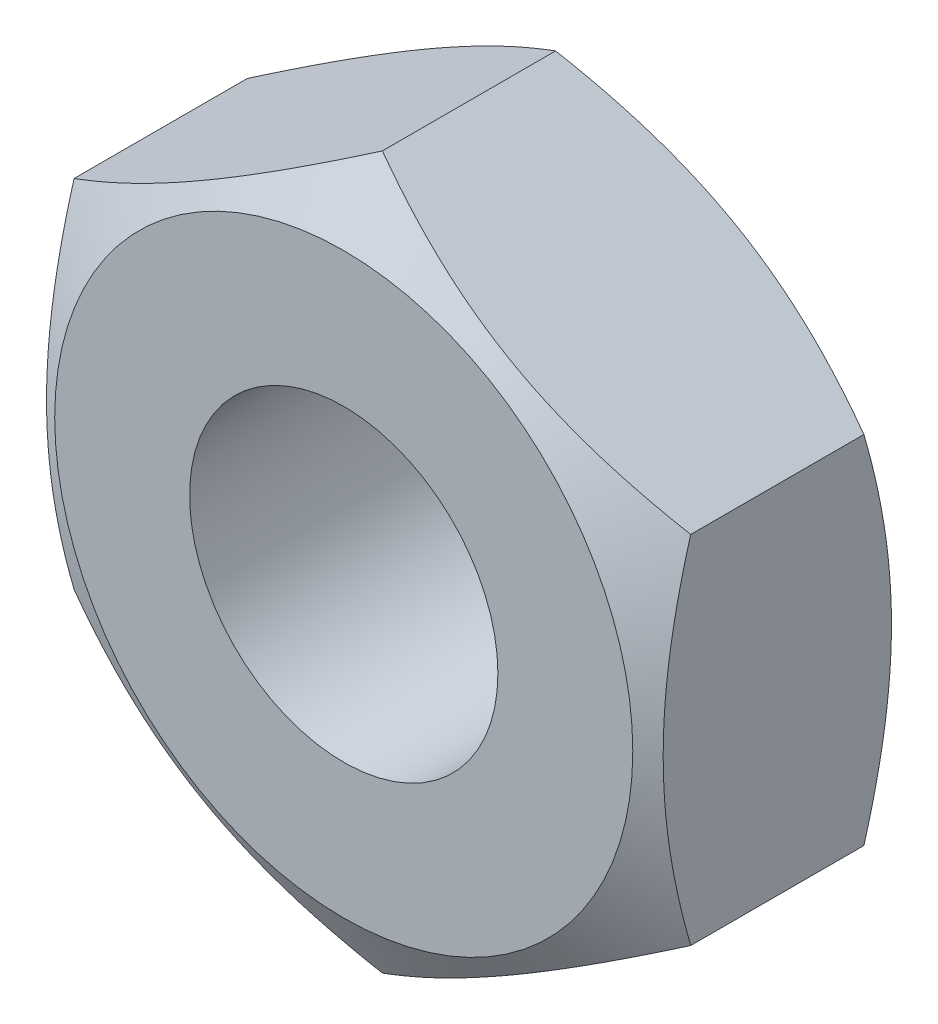
ISO-10303-21;
HEADER;
FILE_DESCRIPTION(('STEP AP214'),'2;1');
FILE_NAME('part.step','',(''),(''),'','','');
FILE_SCHEMA(('AUTOMOTIVE_DESIGN { 1 0 10303 214 1 1 1 1 }'));
ENDSEC;
DATA;
#1=APPLICATION_CONTEXT('core data for automotive mechanical design processes');
#2=APPLICATION_PROTOCOL_DEFINITION('international standard','automotive_design',2000,#1);
#3=PRODUCT_CONTEXT('',#1,'mechanical');
#4=PRODUCT('Part','Part','',(#3));
#5=PRODUCT_RELATED_PRODUCT_CATEGORY('part','',(#4));
#6=PRODUCT_DEFINITION_FORMATION('','',#4);
#7=PRODUCT_DEFINITION_CONTEXT('part definition',#1,'design');
#8=PRODUCT_DEFINITION('design','',#6,#7);
#9=PRODUCT_DEFINITION_SHAPE('','',#8);
#10=(LENGTH_UNIT() NAMED_UNIT(*) SI_UNIT(.MILLI.,.METRE.));
#11=(NAMED_UNIT(*) PLANE_ANGLE_UNIT() SI_UNIT($,.RADIAN.));
#12=(NAMED_UNIT(*) SI_UNIT($,.STERADIAN.) SOLID_ANGLE_UNIT());
#13=UNCERTAINTY_MEASURE_WITH_UNIT(LENGTH_MEASURE(1.E-05),#10,'distance_accuracy_value','');
#14=(GEOMETRIC_REPRESENTATION_CONTEXT(3) GLOBAL_UNCERTAINTY_ASSIGNED_CONTEXT((#13)) GLOBAL_UNIT_ASSIGNED_CONTEXT((#10,
#11,#12)) REPRESENTATION_CONTEXT('',''));
#15=CARTESIAN_POINT('',(0.,0.,0.));
#16=DIRECTION('',(0.,0.,1.));
#17=DIRECTION('',(1.,0.,0.));
#18=AXIS2_PLACEMENT_3D('',#15,#16,#17);
#19=CARTESIAN_POINT('',(0.,0.,1.3));
#20=DIRECTION('',(0.,0.,1.));
#21=DIRECTION('',(1.,0.,0.));
#22=AXIS2_PLACEMENT_3D('',#19,#20,#21);
#23=PLANE('',#22);
#24=CARTESIAN_POINT('',(0.,0.,1.3));
#25=DIRECTION('',(0.,0.,1.));
#26=DIRECTION('',(1.,0.,0.));
#27=AXIS2_PLACEMENT_3D('',#24,#25,#26);
#28=CIRCLE('',#27,0.8);
#29=CARTESIAN_POINT('',(0.8,0.,1.3));
#30=VERTEX_POINT('',#29);
#31=EDGE_CURVE('E114',#30,#30,#28,.T.);
#32=ORIENTED_EDGE('',*,*,#31,.F.);
#33=EDGE_LOOP('',(#32));
#34=FACE_BOUND('',#33,.T.);
#35=CARTESIAN_POINT('',(0.,0.,1.30000000012503));
#36=DIRECTION('',(0.,0.,1.));
#37=DIRECTION('',(1.,0.,0.));
#38=AXIS2_PLACEMENT_3D('',#35,#36,#37);
#39=CIRCLE('',#38,1.5);
#40=CARTESIAN_POINT('',(1.5,0.,1.30000000012503));
#41=VERTEX_POINT('',#40);
#42=EDGE_CURVE('E107',#41,#41,#39,.T.);
#43=ORIENTED_EDGE('',*,*,#42,.T.);
#44=EDGE_LOOP('',(#43));
#45=FACE_BOUND('',#44,.T.);
#46=ADVANCED_FACE('F35',(#34,#45),#23,.T.);
#47=CARTESIAN_POINT('',(0.,0.,0.));
#48=DIRECTION('',(0.,0.,1.));
#49=DIRECTION('',(1.,0.,0.));
#50=AXIS2_PLACEMENT_3D('',#47,#48,#49);
#51=PLANE('',#50);
#52=CARTESIAN_POINT('',(0.,0.,0.));
#53=DIRECTION('',(0.,0.,1.));
#54=DIRECTION('',(1.,0.,0.));
#55=AXIS2_PLACEMENT_3D('',#52,#53,#54);
#56=CIRCLE('',#55,0.8);
#57=CARTESIAN_POINT('',(0.8,0.,0.));
#58=VERTEX_POINT('',#57);
#59=EDGE_CURVE('E193',#58,#58,#56,.T.);
#60=ORIENTED_EDGE('',*,*,#59,.T.);
#61=EDGE_LOOP('',(#60));
#62=FACE_BOUND('',#61,.T.);
#63=CARTESIAN_POINT('',(0.,0.,0.));
#64=DIRECTION('',(0.,0.,1.));
#65=DIRECTION('',(1.,0.,0.));
#66=AXIS2_PLACEMENT_3D('',#63,#64,#65);
#67=CIRCLE('',#66,1.5);
#68=CARTESIAN_POINT('',(1.5,0.,0.));
#69=VERTEX_POINT('',#68);
#70=EDGE_CURVE('E216',#69,#69,#67,.T.);
#71=ORIENTED_EDGE('',*,*,#70,.F.);
#72=EDGE_LOOP('',(#71));
#73=FACE_BOUND('',#72,.T.);
#74=ADVANCED_FACE('F198',(#62,#73),#51,.F.);
#75=CARTESIAN_POINT('',(0.,0.,1.3));
#76=DIRECTION('',(0.,0.,-1.));
#77=DIRECTION('',(-1.,0.,0.));
#78=AXIS2_PLACEMENT_3D('',#75,#76,#77);
#79=CYLINDRICAL_SURFACE('',#78,0.8);
#80=ORIENTED_EDGE('',*,*,#31,.T.);
#81=EDGE_LOOP('',(#80));
#82=FACE_BOUND('',#81,.T.);
#83=ORIENTED_EDGE('',*,*,#59,.F.);
#84=EDGE_LOOP('',(#83));
#85=FACE_BOUND('',#84,.T.);
#86=ADVANCED_FACE('F134',(#82,#85),#79,.F.);
#87=CARTESIAN_POINT('',(0.,0.,0.));
#88=DIRECTION('',(0.,0.,1.));
#89=DIRECTION('',(1.,0.,0.));
#90=AXIS2_PLACEMENT_3D('',#87,#88,#89);
#91=CONICAL_SURFACE('',#90,1.5,1.0471975511966);
#92=ORIENTED_EDGE('',*,*,#70,.T.);
#93=EDGE_LOOP('',(#92));
#94=FACE_BOUND('',#93,.T.);
#95=CARTESIAN_POINT('',(1.6,-2.50468577349947,0.849924364708279));
#96=CARTESIAN_POINT('',(1.6,-2.43460202767632,0.815834229493611));
#97=CARTESIAN_POINT('',(1.6,-2.36435988277678,0.782064282266355));
#98=CARTESIAN_POINT('',(1.6,-2.22347464374357,0.715344391971627));
#99=CARTESIAN_POINT('',(1.6,-2.15283149057303,0.682394573702752));
#100=CARTESIAN_POINT('',(1.6,-2.01070721107587,0.617333772923658));
#101=CARTESIAN_POINT('',(1.6,-1.93922362991863,0.585228134841448));
#102=CARTESIAN_POINT('',(1.6,-1.79569600555535,0.522299939713627));
#103=CARTESIAN_POINT('',(1.6,-1.7236519883453,0.491477323570933));
#104=CARTESIAN_POINT('',(1.6,-1.57647188654226,0.430450934809684));
#105=CARTESIAN_POINT('',(1.6,-1.50131286926166,0.400302173904053));
#106=CARTESIAN_POINT('',(1.6,-1.35013913756586,0.342236448927622));
#107=CARTESIAN_POINT('',(1.6,-1.27412449944285,0.314319287644696));
#108=CARTESIAN_POINT('',(1.6,-1.12123118076986,0.261423138023252));
#109=CARTESIAN_POINT('',(1.6,-1.04435441135613,0.236438680118373));
#110=CARTESIAN_POINT('',(1.6,-0.889498311160903,0.190197331537013));
#111=CARTESIAN_POINT('',(1.6,-0.811519328440935,0.168939291331615));
#112=CARTESIAN_POINT('',(1.6,-0.654849893225062,0.13126960000048));
#113=CARTESIAN_POINT('',(1.6,-0.576166055574703,0.114830940598855));
#114=CARTESIAN_POINT('',(1.6,-0.417796450437888,0.0877122194528207));
#115=CARTESIAN_POINT('',(1.6,-0.338110786381295,0.0770315681597521));
#116=CARTESIAN_POINT('',(1.6,-0.179182918859722,0.0624224858831523));
#117=CARTESIAN_POINT('',(1.6,-0.0999491003970868,0.0584054203386161));
#118=CARTESIAN_POINT('',(1.6,0.0585680255774531,0.0572191037037551));
#119=CARTESIAN_POINT('',(1.6,0.137851333742923,0.060049945045673));
#120=CARTESIAN_POINT('',(1.6,0.326668372227038,0.0747029236686141));
#121=CARTESIAN_POINT('',(1.6,0.435965640909333,0.0895957439673925));
#122=CARTESIAN_POINT('',(1.6,0.652617213639149,0.129849667065771));
#123=CARTESIAN_POINT('',(1.6,0.759969595784866,0.155220591740375));
#124=CARTESIAN_POINT('',(1.6,0.974924274381047,0.214303547661166));
#125=CARTESIAN_POINT('',(1.6,1.08247664582103,0.248192283993812));
#126=CARTESIAN_POINT('',(1.6,1.29558108116508,0.321579269655054));
#127=CARTESIAN_POINT('',(1.6,1.40113363338861,0.361076129039921));
#128=CARTESIAN_POINT('',(1.6,1.5845404985729,0.433654774508611));
#129=CARTESIAN_POINT('',(1.6,1.6627384072109,0.465880326280469));
#130=CARTESIAN_POINT('',(1.6,1.81840642852919,0.532048680957597));
#131=CARTESIAN_POINT('',(1.6,1.89587650673311,0.565991564729156));
#132=CARTESIAN_POINT('',(1.6,2.12743694004725,0.669819808515674));
#133=CARTESIAN_POINT('',(1.6,2.28063578728987,0.741687750031884));
#134=CARTESIAN_POINT('',(1.6,2.58560592559201,0.888815459798253));
#135=CARTESIAN_POINT('',(1.6,2.73737525417081,0.964079246320414));
#136=CARTESIAN_POINT('',(1.6,3.03980063395272,1.11681986452274));
#137=CARTESIAN_POINT('',(1.6,3.19045664179478,1.19429678183293));
#138=CARTESIAN_POINT('',(1.6,3.47701061226264,1.34351109896333));
#139=CARTESIAN_POINT('',(1.6,3.61297937273298,1.41511304145496));
#140=CARTESIAN_POINT('',(1.6,3.88442686694764,1.55925376677231));
#141=CARTESIAN_POINT('',(1.6,4.0199055780314,1.63179259222944));
#142=CARTESIAN_POINT('',(1.6,4.29009317245364,1.77736525360535));
#143=CARTESIAN_POINT('',(1.6,4.42480314919195,1.85039706315399));
#144=CARTESIAN_POINT('',(1.6,4.69391357143419,1.99700833408194));
#145=CARTESIAN_POINT('',(1.6,4.82831403641932,2.07058775968729));
#146=CARTESIAN_POINT('',(1.6,4.96260277023241,2.14436915812481));
#147=B_SPLINE_CURVE_WITH_KNOTS('',3,(#95,#96,#97,#98,#99,#100,#101,#102,#103,#104,#105,#106,
#107,#108,#109,#110,#111,#112,#113,#114,#115,#116,#117,#118,#119,#120,#121,#122,#123,#124,#125,
#126,#127,#128,#129,#130,#131,#132,#133,#134,#135,#136,#137,#138,#139,#140,#141,#142,#143,#144,
#145,#146),.UNSPECIFIED.,.F.,.F.,(4,2,2,2,2,2,2,2,2,2,2,2,2,2,2,2,2,2,2,2,2,2,2,2,2,4),(0.,
0.233807833018182,0.467651029591404,0.702728285106271,0.937794700753746,1.18070863494921,
1.42360107843628,1.66603307095725,1.90839014571078,2.14936186148741,2.3903089000591,
2.62802454191942,2.86574339245545,3.19598511535766,3.52653710253775,3.86461264091271,
4.20260453483314,4.45631563281145,4.71003868875991,5.21761984108872,5.72581822450906,
6.23403629775007,6.69504085670935,7.15606646740554,7.61576479207938,8.07543334526515),.UNSPECIFIED.);
#148=CARTESIAN_POINT('',(1.6,-0.923760430703524,0.200641262882147));
#149=VERTEX_POINT('',#148);
#150=CARTESIAN_POINT('',(1.6,0.923760430703403,0.200641262882228));
#151=VERTEX_POINT('',#150);
#152=EDGE_CURVE('E49',#149,#151,#147,.T.);
#153=ORIENTED_EDGE('',*,*,#152,.F.);
#154=CARTESIAN_POINT('',(-0.000199999999999637,-1.84763633146064,0.200707935798504));
#155=CARTESIAN_POINT('',(0.0701136854573882,-1.8070407062341,0.177258896270012));
#156=CARTESIAN_POINT('',(0.141034310183559,-1.76609466445735,0.155932385774773));
#157=CARTESIAN_POINT('',(0.284103777914678,-1.68349346874997,0.118705682783099));
#158=CARTESIAN_POINT('',(0.356255164197867,-1.64183684645697,0.102818661565885));
#159=CARTESIAN_POINT('',(0.499663699421224,-1.55903989004167,0.0780867414837104));
#160=CARTESIAN_POINT('',(0.570898775556808,-1.51791229965905,0.0690772633205731));
#161=CARTESIAN_POINT('',(0.713704334232898,-1.43546347191564,0.0583192981629597));
#162=CARTESIAN_POINT('',(0.785274297265459,-1.3941425344929,0.0565619053141473));
#163=CARTESIAN_POINT('',(0.919021456137727,-1.31692357631464,0.0602061999775941));
#164=CARTESIAN_POINT('',(0.981218612598265,-1.28101403128932,0.0647130860065737));
#165=CARTESIAN_POINT('',(1.10520768651606,-1.20942890608631,0.0790009031127711));
#166=CARTESIAN_POINT('',(1.166999174705,-1.1737535737468,0.0887867210151748));
#167=CARTESIAN_POINT('',(1.29124415835336,-1.10202069899196,0.113251938248456));
#168=CARTESIAN_POINT('',(1.35368191824457,-1.06597224151117,0.128035106841821));
#169=CARTESIAN_POINT('',(1.47762587183774,-0.994413166539727,0.161587634702251));
#170=CARTESIAN_POINT('',(1.5391336550422,-0.958901631349374,0.180349103662926));
#171=CARTESIAN_POINT('',(1.6002,-0.923644960649564,0.200707935798504));
#172=B_SPLINE_CURVE_WITH_KNOTS('',3,(#154,#155,#156,#157,#158,#159,#160,#161,#162,#163,#164,
#165,#166,#167,#168,#169,#170,#171),.UNSPECIFIED.,.F.,.F.,(4,2,2,2,2,2,2,2,4),(0.,
0.25362862266248,0.507867113505243,0.755812447259193,1.00345320332839,1.21912891721902,
1.43500463041921,1.65567058644228,1.87590291418785),.UNSPECIFIED.);
#173=CARTESIAN_POINT('',(0.,-1.8475208614068,0.200641262882228));
#174=VERTEX_POINT('',#173);
#175=EDGE_CURVE('E92',#174,#149,#172,.T.);
#176=ORIENTED_EDGE('',*,*,#175,.F.);
#177=CARTESIAN_POINT('',(-1.6002,-0.923644960649564,0.200707935798504));
#178=CARTESIAN_POINT('',(-1.52988631454261,-0.964240585876102,0.177258896270012));
#179=CARTESIAN_POINT('',(-1.45896568981644,-1.00518662765285,0.155932385774773));
#180=CARTESIAN_POINT('',(-1.31589622208532,-1.08778782336023,0.118705682783099));
#181=CARTESIAN_POINT('',(-1.24374483580213,-1.12944444565323,0.102818661565886));
#182=CARTESIAN_POINT('',(-1.10033630057878,-1.21224140206853,0.0780867414837107));
#183=CARTESIAN_POINT('',(-1.02910122444319,-1.25336899245115,0.0690772633205732));
#184=CARTESIAN_POINT('',(-0.886295665767102,-1.33581782019457,0.0583192981629597));
#185=CARTESIAN_POINT('',(-0.814725702734541,-1.37713875761731,0.0565619053141474));
#186=CARTESIAN_POINT('',(-0.680978543862273,-1.45435771579556,0.0602061999775942));
#187=CARTESIAN_POINT('',(-0.618781387401734,-1.49026726082088,0.0647130860065738));
#188=CARTESIAN_POINT('',(-0.494792313483936,-1.56185238602389,0.0790009031127712));
#189=CARTESIAN_POINT('',(-0.433000825294996,-1.59752771836341,0.0887867210151749));
#190=CARTESIAN_POINT('',(-0.30875584164664,-1.66926059311824,0.113251938248456));
#191=CARTESIAN_POINT('',(-0.246318081755429,-1.70530905059903,0.128035106841821));
#192=CARTESIAN_POINT('',(-0.122374128162256,-1.77686812557048,0.161587634702252));
#193=CARTESIAN_POINT('',(-0.0608663449577952,-1.81237966076083,0.180349103662926));
#194=CARTESIAN_POINT('',(0.000200000000000447,-1.84763633146064,0.200707935798504));
#195=B_SPLINE_CURVE_WITH_KNOTS('',3,(#177,#178,#179,#180,#181,#182,#183,#184,#185,#186,#187,
#188,#189,#190,#191,#192,#193,#194),.UNSPECIFIED.,.F.,.F.,(4,2,2,2,2,2,2,2,4),(0.,
0.253628622662481,0.507867113505244,0.755812447259193,1.00345320332839,1.21912891721902,
1.43500463041921,1.65567058644228,1.87590291418785),.UNSPECIFIED.);
#196=CARTESIAN_POINT('',(-1.6,-0.923760430703402,0.200641262882228));
#197=VERTEX_POINT('',#196);
#198=EDGE_CURVE('E106',#197,#174,#195,.T.);
#199=ORIENTED_EDGE('',*,*,#198,.F.);
#200=CARTESIAN_POINT('',(-1.6,-2.50468577349947,0.84992436470828));
#201=CARTESIAN_POINT('',(-1.6,-2.43460202767632,0.815834229493612));
#202=CARTESIAN_POINT('',(-1.6,-2.36435988277678,0.782064282266356));
#203=CARTESIAN_POINT('',(-1.6,-2.22347464374357,0.715344391971628));
#204=CARTESIAN_POINT('',(-1.6,-2.15283149057303,0.682394573702753));
#205=CARTESIAN_POINT('',(-1.6,-2.01070721107587,0.617333772923659));
#206=CARTESIAN_POINT('',(-1.6,-1.93922362991863,0.585228134841448));
#207=CARTESIAN_POINT('',(-1.6,-1.79569600555535,0.522299939713628));
#208=CARTESIAN_POINT('',(-1.6,-1.72365198834531,0.491477323570934));
#209=CARTESIAN_POINT('',(-1.6,-1.57647188654226,0.430450934809684));
#210=CARTESIAN_POINT('',(-1.6,-1.50131286926166,0.400302173904053));
#211=CARTESIAN_POINT('',(-1.6,-1.35013913756586,0.342236448927622));
#212=CARTESIAN_POINT('',(-1.6,-1.27412449944285,0.314319287644696));
#213=CARTESIAN_POINT('',(-1.6,-1.12123118076986,0.261423138023253));
#214=CARTESIAN_POINT('',(-1.6,-1.04435441135613,0.236438680118373));
#215=CARTESIAN_POINT('',(-1.6,-0.889498311160903,0.190197331537014));
#216=CARTESIAN_POINT('',(-1.6,-0.811519328440935,0.168939291331615));
#217=CARTESIAN_POINT('',(-1.6,-0.654849893225062,0.131269600000481));
#218=CARTESIAN_POINT('',(-1.6,-0.576166055574703,0.114830940598856));
#219=CARTESIAN_POINT('',(-1.6,-0.417796450437888,0.0877122194528216));
#220=CARTESIAN_POINT('',(-1.6,-0.338110786381295,0.077031568159753));
#221=CARTESIAN_POINT('',(-1.6,-0.179182918859722,0.0624224858831532));
#222=CARTESIAN_POINT('',(-1.6,-0.0999491003970865,0.0584054203386169));
#223=CARTESIAN_POINT('',(-1.6,0.0585680255774536,0.057219103703756));
#224=CARTESIAN_POINT('',(-1.6,0.137851333742924,0.060049945045674));
#225=CARTESIAN_POINT('',(-1.6,0.326668372227039,0.0747029236686151));
#226=CARTESIAN_POINT('',(-1.6,0.435965640909334,0.0895957439673934));
#227=CARTESIAN_POINT('',(-1.6,0.65261721363915,0.129849667065772));
#228=CARTESIAN_POINT('',(-1.6,0.759969595784867,0.155220591740376));
#229=CARTESIAN_POINT('',(-1.6,0.974924274381048,0.214303547661167));
#230=CARTESIAN_POINT('',(-1.6,1.08247664582103,0.248192283993813));
#231=CARTESIAN_POINT('',(-1.6,1.29558108116508,0.321579269655055));
#232=CARTESIAN_POINT('',(-1.6,1.40113363338861,0.361076129039923));
#233=CARTESIAN_POINT('',(-1.6,1.5845404985729,0.433654774508612));
#234=CARTESIAN_POINT('',(-1.6,1.6627384072109,0.46588032628047));
#235=CARTESIAN_POINT('',(-1.6,1.81840642852919,0.532048680957598));
#236=CARTESIAN_POINT('',(-1.6,1.89587650673311,0.565991564729158));
#237=CARTESIAN_POINT('',(-1.6,2.12743694004725,0.669819808515675));
#238=CARTESIAN_POINT('',(-1.6,2.28063578728987,0.741687750031885));
#239=CARTESIAN_POINT('',(-1.6,2.58560592559201,0.888815459798254));
#240=CARTESIAN_POINT('',(-1.6,2.73737525417081,0.964079246320415));
#241=CARTESIAN_POINT('',(-1.6,3.03980063395272,1.11681986452274));
#242=CARTESIAN_POINT('',(-1.6,3.19045664179478,1.19429678183293));
#243=CARTESIAN_POINT('',(-1.6,3.47701061226264,1.34351109896333));
#244=CARTESIAN_POINT('',(-1.6,3.61297937273298,1.41511304145496));
#245=CARTESIAN_POINT('',(-1.6,3.88442686694764,1.55925376677231));
#246=CARTESIAN_POINT('',(-1.6,4.0199055780314,1.63179259222944));
#247=CARTESIAN_POINT('',(-1.6,4.29009317245364,1.77736525360535));
#248=CARTESIAN_POINT('',(-1.6,4.42480314919194,1.85039706315399));
#249=CARTESIAN_POINT('',(-1.6,4.69391357143419,1.99700833408194));
#250=CARTESIAN_POINT('',(-1.6,4.82831403641932,2.07058775968729));
#251=CARTESIAN_POINT('',(-1.6,4.96260277023241,2.14436915812481));
#252=B_SPLINE_CURVE_WITH_KNOTS('',3,(#200,#201,#202,#203,#204,#205,#206,#207,#208,#209,#210,
#211,#212,#213,#214,#215,#216,#217,#218,#219,#220,#221,#222,#223,#224,#225,#226,#227,#228,#229,
#230,#231,#232,#233,#234,#235,#236,#237,#238,#239,#240,#241,#242,#243,#244,#245,#246,#247,#248,
#249,#250,#251),.UNSPECIFIED.,.F.,.F.,(4,2,2,2,2,2,2,2,2,2,2,2,2,2,2,2,2,2,2,2,2,2,2,2,2,4),(0.,
0.233807833018182,0.467651029591404,0.702728285106272,0.937794700753747,1.18070863494921,
1.42360107843628,1.66603307095725,1.90839014571078,2.14936186148741,2.3903089000591,
2.62802454191942,2.86574339245545,3.19598511535766,3.52653710253775,3.86461264091271,
4.20260453483314,4.45631563281145,4.71003868875991,5.21761984108873,5.72581822450906,
6.23403629775007,6.69504085670935,7.15606646740554,7.61576479207938,8.07543334526515),.UNSPECIFIED.);
#253=CARTESIAN_POINT('',(-1.6,0.923760430703401,0.200641262882228));
#254=VERTEX_POINT('',#253);
#255=EDGE_CURVE('E154',#254,#197,#252,.F.);
#256=ORIENTED_EDGE('',*,*,#255,.F.);
#257=CARTESIAN_POINT('',(0.000200000000000008,1.84763633146064,0.200707935798504));
#258=CARTESIAN_POINT('',(-0.0701136854573879,1.8070407062341,0.177258896270012));
#259=CARTESIAN_POINT('',(-0.141034310183559,1.76609466445735,0.155932385774773));
#260=CARTESIAN_POINT('',(-0.284103777914677,1.68349346874997,0.118705682783099));
#261=CARTESIAN_POINT('',(-0.356255164197866,1.64183684645697,0.102818661565885));
#262=CARTESIAN_POINT('',(-0.499663699421223,1.55903989004167,0.0780867414837104));
#263=CARTESIAN_POINT('',(-0.570898775556807,1.51791229965905,0.0690772633205731));
#264=CARTESIAN_POINT('',(-0.713704334232897,1.43546347191564,0.0583192981629596));
#265=CARTESIAN_POINT('',(-0.785274297265459,1.3941425344929,0.0565619053141473));
#266=CARTESIAN_POINT('',(-0.919021456137727,1.31692357631464,0.060206199977594));
#267=CARTESIAN_POINT('',(-0.981218612598265,1.28101403128932,0.0647130860065735));
#268=CARTESIAN_POINT('',(-1.10520768651606,1.20942890608631,0.0790009031127709));
#269=CARTESIAN_POINT('',(-1.166999174705,1.1737535737468,0.0887867210151747));
#270=CARTESIAN_POINT('',(-1.29124415835336,1.10202069899196,0.113251938248456));
#271=CARTESIAN_POINT('',(-1.35368191824457,1.06597224151117,0.128035106841821));
#272=CARTESIAN_POINT('',(-1.47762587183774,0.994413166539726,0.161587634702252));
#273=CARTESIAN_POINT('',(-1.5391336550422,0.958901631349373,0.180349103662926));
#274=CARTESIAN_POINT('',(-1.6002,0.923644960649563,0.200707935798504));
#275=B_SPLINE_CURVE_WITH_KNOTS('',3,(#257,#258,#259,#260,#261,#262,#263,#264,#265,#266,#267,
#268,#269,#270,#271,#272,#273,#274),.UNSPECIFIED.,.F.,.F.,(4,2,2,2,2,2,2,2,4),(0.,
0.25362862266248,0.507867113505243,0.755812447259193,1.00345320332839,1.21912891721902,
1.43500463041921,1.65567058644228,1.87590291418785),.UNSPECIFIED.);
#276=CARTESIAN_POINT('',(0.,1.8475208614068,0.200641262882228));
#277=VERTEX_POINT('',#276);
#278=EDGE_CURVE('E160',#277,#254,#275,.T.);
#279=ORIENTED_EDGE('',*,*,#278,.F.);
#280=CARTESIAN_POINT('',(1.6002,0.923644960649565,0.200707935798504));
#281=CARTESIAN_POINT('',(1.52988631454261,0.964240585876103,0.177258896270012));
#282=CARTESIAN_POINT('',(1.45896568981644,1.00518662765285,0.155932385774773));
#283=CARTESIAN_POINT('',(1.31589622208532,1.08778782336023,0.118705682783099));
#284=CARTESIAN_POINT('',(1.24374483580213,1.12944444565324,0.102818661565885));
#285=CARTESIAN_POINT('',(1.10033630057877,1.21224140206853,0.0780867414837105));
#286=CARTESIAN_POINT('',(1.02910122444319,1.25336899245115,0.0690772633205732));
#287=CARTESIAN_POINT('',(0.886295665767101,1.33581782019457,0.0583192981629599));
#288=CARTESIAN_POINT('',(0.814725702734539,1.37713875761731,0.0565619053141476));
#289=CARTESIAN_POINT('',(0.680978543862271,1.45435771579556,0.0602061999775944));
#290=CARTESIAN_POINT('',(0.618781387401733,1.49026726082088,0.064713086006574));
#291=CARTESIAN_POINT('',(0.494792313483935,1.5618523860239,0.0790009031127715));
#292=CARTESIAN_POINT('',(0.433000825294995,1.59752771836341,0.0887867210151753));
#293=CARTESIAN_POINT('',(0.30875584164664,1.66926059311825,0.113251938248457));
#294=CARTESIAN_POINT('',(0.246318081755429,1.70530905059903,0.128035106841822));
#295=CARTESIAN_POINT('',(0.122374128162256,1.77686812557048,0.161587634702252));
#296=CARTESIAN_POINT('',(0.0608663449577955,1.81237966076083,0.180349103662926));
#297=CARTESIAN_POINT('',(-0.000200000000000167,1.84763633146064,0.200707935798504));
#298=B_SPLINE_CURVE_WITH_KNOTS('',3,(#280,#281,#282,#283,#284,#285,#286,#287,#288,#289,#290,
#291,#292,#293,#294,#295,#296,#297),.UNSPECIFIED.,.F.,.F.,(4,2,2,2,2,2,2,2,4),(0.,
0.25362862266248,0.507867113505243,0.755812447259193,1.00345320332839,1.21912891721902,
1.43500463041921,1.65567058644228,1.87590291418785),.UNSPECIFIED.);
#299=EDGE_CURVE('E63',#151,#277,#298,.T.);
#300=ORIENTED_EDGE('',*,*,#299,.F.);
#301=EDGE_LOOP('',(#153,#176,#199,#256,#279,#300));
#302=FACE_BOUND('',#301,.T.);
#303=ADVANCED_FACE('F91',(#94,#302),#91,.T.);
#304=CARTESIAN_POINT('',(0.,0.,1.30000000012503));
#305=DIRECTION('',(0.,0.,-1.));
#306=DIRECTION('',(-1.,0.,0.));
#307=AXIS2_PLACEMENT_3D('',#304,#305,#306);
#308=CONICAL_SURFACE('',#307,1.5,1.0471975511966);
#309=ORIENTED_EDGE('',*,*,#42,.F.);
#310=EDGE_LOOP('',(#309));
#311=FACE_BOUND('',#310,.T.);
#312=CARTESIAN_POINT('',(1.6002,0.923644960649565,1.09929206432652));
#313=CARTESIAN_POINT('',(1.52988631454261,0.964240585876103,1.12274110385502));
#314=CARTESIAN_POINT('',(1.45896568981644,1.00518662765285,1.14406761435026));
#315=CARTESIAN_POINT('',(1.31589622208532,1.08778782336023,1.18129431734193));
#316=CARTESIAN_POINT('',(1.24374483580213,1.12944444565324,1.19718133855914));
#317=CARTESIAN_POINT('',(1.10033630057877,1.21224140206853,1.22191325864132));
#318=CARTESIAN_POINT('',(1.02910122444319,1.25336899245115,1.23092273680445));
#319=CARTESIAN_POINT('',(0.886295665767101,1.33581782019457,1.24168070196207));
#320=CARTESIAN_POINT('',(0.814725702734539,1.37713875761731,1.24343809481088));
#321=CARTESIAN_POINT('',(0.680978543862271,1.45435771579556,1.23979380014743));
#322=CARTESIAN_POINT('',(0.618781387401733,1.49026726082088,1.23528691411845));
#323=CARTESIAN_POINT('',(0.494792313483935,1.5618523860239,1.22099909701226));
#324=CARTESIAN_POINT('',(0.433000825294995,1.59752771836341,1.21121327910985));
#325=CARTESIAN_POINT('',(0.30875584164664,1.66926059311825,1.18674806187657));
#326=CARTESIAN_POINT('',(0.246318081755429,1.70530905059903,1.17196489328321));
#327=CARTESIAN_POINT('',(0.122374128162257,1.77686812557048,1.13841236542278));
#328=CARTESIAN_POINT('',(0.0608663449577957,1.81237966076083,1.1196508964621));
#329=CARTESIAN_POINT('',(-0.000199999999999724,1.84763633146064,1.09929206432652));
#330=B_SPLINE_CURVE_WITH_KNOTS('',3,(#312,#313,#314,#315,#316,#317,#318,#319,#320,#321,#322,
#323,#324,#325,#326,#327,#328,#329),.UNSPECIFIED.,.F.,.F.,(4,2,2,2,2,2,2,2,4),(0.,
0.25362862266248,0.507867113505243,0.755812447259193,1.00345320332839,1.21912891721902,
1.43500463041921,1.65567058644228,1.87590291418785),.UNSPECIFIED.);
#331=CARTESIAN_POINT('',(1.6,0.923760430703403,1.0993587372428));
#332=VERTEX_POINT('',#331);
#333=CARTESIAN_POINT('',(0.,1.8475208614068,1.0993587372428));
#334=VERTEX_POINT('',#333);
#335=EDGE_CURVE('E183',#332,#334,#330,.T.);
#336=ORIENTED_EDGE('',*,*,#335,.T.);
#337=CARTESIAN_POINT('',(0.000200000000000023,1.84763633146064,1.09929206432652));
#338=CARTESIAN_POINT('',(-0.0701136854573879,1.8070407062341,1.12274110385502));
#339=CARTESIAN_POINT('',(-0.141034310183559,1.76609466445735,1.14406761435025));
#340=CARTESIAN_POINT('',(-0.284103777914677,1.68349346874997,1.18129431734193));
#341=CARTESIAN_POINT('',(-0.356255164197866,1.64183684645697,1.19718133855914));
#342=CARTESIAN_POINT('',(-0.499663699421223,1.55903989004167,1.22191325864132));
#343=CARTESIAN_POINT('',(-0.570898775556807,1.51791229965905,1.23092273680445));
#344=CARTESIAN_POINT('',(-0.713704334232898,1.43546347191564,1.24168070196207));
#345=CARTESIAN_POINT('',(-0.785274297265459,1.3941425344929,1.24343809481088));
#346=CARTESIAN_POINT('',(-0.919021456137727,1.31692357631464,1.23979380014743));
#347=CARTESIAN_POINT('',(-0.981218612598265,1.28101403128932,1.23528691411845));
#348=CARTESIAN_POINT('',(-1.10520768651606,1.20942890608631,1.22099909701226));
#349=CARTESIAN_POINT('',(-1.166999174705,1.1737535737468,1.21121327910985));
#350=CARTESIAN_POINT('',(-1.29124415835336,1.10202069899196,1.18674806187657));
#351=CARTESIAN_POINT('',(-1.35368191824457,1.06597224151117,1.17196489328321));
#352=CARTESIAN_POINT('',(-1.47762587183774,0.994413166539726,1.13841236542278));
#353=CARTESIAN_POINT('',(-1.5391336550422,0.958901631349373,1.1196508964621));
#354=CARTESIAN_POINT('',(-1.6002,0.923644960649563,1.09929206432652));
#355=B_SPLINE_CURVE_WITH_KNOTS('',3,(#337,#338,#339,#340,#341,#342,#343,#344,#345,#346,#347,
#348,#349,#350,#351,#352,#353,#354),.UNSPECIFIED.,.F.,.F.,(4,2,2,2,2,2,2,2,4),(0.,
0.253628622662481,0.507867113505243,0.755812447259193,1.00345320332839,1.21912891721902,
1.43500463041921,1.65567058644228,1.87590291418785),.UNSPECIFIED.);
#356=CARTESIAN_POINT('',(-1.6,0.923760430703401,1.0993587372428));
#357=VERTEX_POINT('',#356);
#358=EDGE_CURVE('E177',#334,#357,#355,.T.);
#359=ORIENTED_EDGE('',*,*,#358,.T.);
#360=CARTESIAN_POINT('',(-1.6,-2.50468577351708,0.45007563540818));
#361=CARTESIAN_POINT('',(-1.6,-2.43460202769379,0.484165770622988));
#362=CARTESIAN_POINT('',(-1.6,-2.3643598827941,0.517935717850388));
#363=CARTESIAN_POINT('',(-1.6,-2.22347464376061,0.584655608145413));
#364=CARTESIAN_POINT('',(-1.6,-2.15283149058993,0.617605426414441));
#365=CARTESIAN_POINT('',(-1.6,-2.0107072110925,0.682666227193851));
#366=CARTESIAN_POINT('',(-1.6,-1.93922362993514,0.714771865276225));
#367=CARTESIAN_POINT('',(-1.6,-1.79569600557161,0.777700060404388));
#368=CARTESIAN_POINT('',(-1.6,-1.72365198836144,0.808522676547262));
#369=CARTESIAN_POINT('',(-1.6,-1.57647188655807,0.869549065308932));
#370=CARTESIAN_POINT('',(-1.6,-1.50131286927727,0.899697826214804));
#371=CARTESIAN_POINT('',(-1.6,-1.35013913758106,0.957763551191739));
#372=CARTESIAN_POINT('',(-1.6,-1.27412449945786,0.985680712474929));
#373=CARTESIAN_POINT('',(-1.6,-1.12123118078447,1.03857686209693));
#374=CARTESIAN_POINT('',(-1.6,-1.04435441137054,1.0635613200021));
#375=CARTESIAN_POINT('',(-1.6,-0.889498311174909,1.10980266858408));
#376=CARTESIAN_POINT('',(-1.6,-0.811519328454738,1.1310607087898));
#377=CARTESIAN_POINT('',(-1.6,-0.65484989323847,1.16873040012161));
#378=CARTESIAN_POINT('',(-1.6,-0.576166055587919,1.18516905952358));
#379=CARTESIAN_POINT('',(-1.6,-0.417796450450701,1.21228778067034));
#380=CARTESIAN_POINT('',(-1.6,-0.338110786393896,1.22296843196377));
#381=CARTESIAN_POINT('',(-1.6,-0.179182918871889,1.23757751424109));
#382=CARTESIAN_POINT('',(-1.6,-0.0999491004090319,1.24159457978599));
#383=CARTESIAN_POINT('',(-1.6,0.0585680255659806,1.24278089642152));
#384=CARTESIAN_POINT('',(-1.6,0.137851333731701,1.23995005507992));
#385=CARTESIAN_POINT('',(-1.6,0.32666837221542,1.22529707645774));
#386=CARTESIAN_POINT('',(-1.6,0.435965640897087,1.21040425615949));
#387=CARTESIAN_POINT('',(-1.6,0.652617213625693,1.17015033306218));
#388=CARTESIAN_POINT('',(-1.6,0.759969595770827,1.14477940838813));
#389=CARTESIAN_POINT('',(-1.6,0.974924274365831,1.08569645246843));
#390=CARTESIAN_POINT('',(-1.6,1.08247664580522,1.05180771613633));
#391=CARTESIAN_POINT('',(-1.6,1.29558108114809,0.97842073047615));
#392=CARTESIAN_POINT('',(-1.6,1.40113363337103,0.938923871091795));
#393=CARTESIAN_POINT('',(-1.6,1.58454049855077,0.866345225625372));
#394=CARTESIAN_POINT('',(-1.6,1.66273840718484,0.834119673855372));
#395=CARTESIAN_POINT('',(-1.6,1.81840642849533,0.767951319182081));
#396=CARTESIAN_POINT('',(-1.6,1.89587650669539,0.734008435412499));
#397=CARTESIAN_POINT('',(-1.6,2.12743693999797,0.630180191632031));
#398=CARTESIAN_POINT('',(-1.6,2.28063578723296,0.558312250120007));
#399=CARTESIAN_POINT('',(-1.6,2.5856059255199,0.411184540362148));
#400=CARTESIAN_POINT('',(-1.6,2.73737525409113,0.335920753844312));
#401=CARTESIAN_POINT('',(-1.6,3.03980063385794,0.183180135650699));
#402=CARTESIAN_POINT('',(-1.6,3.19045664169247,0.105703218344887));
#403=CARTESIAN_POINT('',(-1.6,3.4770106121466,-0.0435110987774373));
#404=CARTESIAN_POINT('',(-1.6,3.61297937261072,-0.115113041265395));
#405=CARTESIAN_POINT('',(-1.6,3.88442686681296,-0.259253766575382));
#406=CARTESIAN_POINT('',(-1.6,4.01990557789051,-0.331792592028842));
#407=CARTESIAN_POINT('',(-1.6,4.29009317230036,-0.477365253397403));
#408=CARTESIAN_POINT('',(-1.6,4.42480314903249,-0.550397062942388));
#409=CARTESIAN_POINT('',(-1.6,4.69391357126237,-0.697008333863014));
#410=CARTESIAN_POINT('',(-1.6,4.82831403624132,-0.770587759464711));
#411=CARTESIAN_POINT('',(-1.6,4.96260277004823,-0.84436915789858));
#412=B_SPLINE_CURVE_WITH_KNOTS('',3,(#360,#361,#362,#363,#364,#365,#366,#367,#368,#369,#370,
#371,#372,#373,#374,#375,#376,#377,#378,#379,#380,#381,#382,#383,#384,#385,#386,#387,#388,#389,
#390,#391,#392,#393,#394,#395,#396,#397,#398,#399,#400,#401,#402,#403,#404,#405,#406,#407,#408,
#409,#410,#411),.UNSPECIFIED.,.F.,.F.,(4,2,2,2,2,2,2,2,2,2,2,2,2,2,2,2,2,2,2,2,2,2,2,2,2,4),(0.,
0.233807833018756,0.467651029592551,0.702728285107967,0.93779470075599,1.18070863495228,
1.42360107844019,1.666033070962,1.90839014571638,2.14936186149379,2.39030890006626,
2.6280245419273,2.86574339246404,3.19598511536417,3.52653710254218,3.86461264091495,
4.20260453483319,4.45631563279849,4.71003868873393,5.2176198410367,5.72581822443093,
6.23403629764583,6.69504085658348,7.15606646725804,7.61576479191034,8.07543334507458),.UNSPECIFIED.);
#413=CARTESIAN_POINT('',(-1.6,-0.923760430703402,1.0993587372428));
#414=VERTEX_POINT('',#413);
#415=EDGE_CURVE('E184',#357,#414,#412,.F.);
#416=ORIENTED_EDGE('',*,*,#415,.T.);
#417=CARTESIAN_POINT('',(-1.6002,-0.923644960649564,1.09929206432652));
#418=CARTESIAN_POINT('',(-1.52988631454261,-0.964240585876102,1.12274110385501));
#419=CARTESIAN_POINT('',(-1.45896568981644,-1.00518662765285,1.14406761435025));
#420=CARTESIAN_POINT('',(-1.31589622208532,-1.08778782336023,1.18129431734193));
#421=CARTESIAN_POINT('',(-1.24374483580213,-1.12944444565323,1.19718133855914));
#422=CARTESIAN_POINT('',(-1.10033630057878,-1.21224140206853,1.22191325864132));
#423=CARTESIAN_POINT('',(-1.02910122444319,-1.25336899245115,1.23092273680445));
#424=CARTESIAN_POINT('',(-0.886295665767102,-1.33581782019457,1.24168070196207));
#425=CARTESIAN_POINT('',(-0.81472570273454,-1.37713875761731,1.24343809481088));
#426=CARTESIAN_POINT('',(-0.680978543862272,-1.45435771579556,1.23979380014743));
#427=CARTESIAN_POINT('',(-0.618781387401734,-1.49026726082088,1.23528691411845));
#428=CARTESIAN_POINT('',(-0.494792313483935,-1.56185238602389,1.22099909701226));
#429=CARTESIAN_POINT('',(-0.433000825294995,-1.59752771836341,1.21121327910985));
#430=CARTESIAN_POINT('',(-0.30875584164664,-1.66926059311825,1.18674806187657));
#431=CARTESIAN_POINT('',(-0.246318081755429,-1.70530905059903,1.17196489328321));
#432=CARTESIAN_POINT('',(-0.122374128162256,-1.77686812557048,1.13841236542278));
#433=CARTESIAN_POINT('',(-0.060866344957795,-1.81237966076083,1.1196508964621));
#434=CARTESIAN_POINT('',(0.000200000000000482,-1.84763633146064,1.09929206432652));
#435=B_SPLINE_CURVE_WITH_KNOTS('',3,(#417,#418,#419,#420,#421,#422,#423,#424,#425,#426,#427,
#428,#429,#430,#431,#432,#433,#434),.UNSPECIFIED.,.F.,.F.,(4,2,2,2,2,2,2,2,4),(0.,
0.25362862266248,0.507867113505243,0.755812447259194,1.0034532033284,1.21912891721902,
1.43500463041921,1.65567058644228,1.87590291418785),.UNSPECIFIED.);
#436=CARTESIAN_POINT('',(0.,-1.8475208614068,1.0993587372428));
#437=VERTEX_POINT('',#436);
#438=EDGE_CURVE('E227',#414,#437,#435,.T.);
#439=ORIENTED_EDGE('',*,*,#438,.T.);
#440=CARTESIAN_POINT('',(-0.00019999999999963,-1.84763633146064,1.09929206432652));
#441=CARTESIAN_POINT('',(0.0701136854573881,-1.8070407062341,1.12274110385502));
#442=CARTESIAN_POINT('',(0.141034310183559,-1.76609466445735,1.14406761435025));
#443=CARTESIAN_POINT('',(0.284103777914678,-1.68349346874997,1.18129431734193));
#444=CARTESIAN_POINT('',(0.356255164197867,-1.64183684645697,1.19718133855914));
#445=CARTESIAN_POINT('',(0.499663699421224,-1.55903989004167,1.22191325864132));
#446=CARTESIAN_POINT('',(0.570898775556808,-1.51791229965905,1.23092273680445));
#447=CARTESIAN_POINT('',(0.713704334232898,-1.43546347191564,1.24168070196207));
#448=CARTESIAN_POINT('',(0.785274297265459,-1.3941425344929,1.24343809481088));
#449=CARTESIAN_POINT('',(0.919021456137727,-1.31692357631464,1.23979380014743));
#450=CARTESIAN_POINT('',(0.981218612598266,-1.28101403128932,1.23528691411845));
#451=CARTESIAN_POINT('',(1.10520768651606,-1.20942890608631,1.22099909701226));
#452=CARTESIAN_POINT('',(1.166999174705,-1.1737535737468,1.21121327910985));
#453=CARTESIAN_POINT('',(1.29124415835336,-1.10202069899196,1.18674806187657));
#454=CARTESIAN_POINT('',(1.35368191824457,-1.06597224151117,1.17196489328321));
#455=CARTESIAN_POINT('',(1.47762587183774,-0.994413166539727,1.13841236542278));
#456=CARTESIAN_POINT('',(1.5391336550422,-0.958901631349374,1.1196508964621));
#457=CARTESIAN_POINT('',(1.6002,-0.923644960649564,1.09929206432652));
#458=B_SPLINE_CURVE_WITH_KNOTS('',3,(#440,#441,#442,#443,#444,#445,#446,#447,#448,#449,#450,
#451,#452,#453,#454,#455,#456,#457),.UNSPECIFIED.,.F.,.F.,(4,2,2,2,2,2,2,2,4),(0.,
0.25362862266248,0.507867113505243,0.755812447259193,1.00345320332839,1.21912891721902,
1.43500463041921,1.65567058644228,1.87590291418785),.UNSPECIFIED.);
#459=CARTESIAN_POINT('',(1.6,-0.923760430703402,1.0993587372428));
#460=VERTEX_POINT('',#459);
#461=EDGE_CURVE('E55',#437,#460,#458,.T.);
#462=ORIENTED_EDGE('',*,*,#461,.T.);
#463=CARTESIAN_POINT('',(1.6,-2.50468577351708,0.450075635408181));
#464=CARTESIAN_POINT('',(1.6,-2.43460202769379,0.484165770622989));
#465=CARTESIAN_POINT('',(1.6,-2.3643598827941,0.517935717850389));
#466=CARTESIAN_POINT('',(1.6,-2.22347464376061,0.584655608145414));
#467=CARTESIAN_POINT('',(1.6,-2.15283149058993,0.617605426414442));
#468=CARTESIAN_POINT('',(1.6,-2.0107072110925,0.682666227193852));
#469=CARTESIAN_POINT('',(1.6,-1.93922362993514,0.714771865276226));
#470=CARTESIAN_POINT('',(1.6,-1.79569600557161,0.777700060404389));
#471=CARTESIAN_POINT('',(1.6,-1.72365198836144,0.808522676547263));
#472=CARTESIAN_POINT('',(1.6,-1.57647188655807,0.869549065308933));
#473=CARTESIAN_POINT('',(1.6,-1.50131286927727,0.899697826214804));
#474=CARTESIAN_POINT('',(1.6,-1.35013913758106,0.95776355119174));
#475=CARTESIAN_POINT('',(1.6,-1.27412449945786,0.98568071247493));
#476=CARTESIAN_POINT('',(1.6,-1.12123118078447,1.03857686209693));
#477=CARTESIAN_POINT('',(1.6,-1.04435441137054,1.0635613200021));
#478=CARTESIAN_POINT('',(1.6,-0.889498311174909,1.10980266858408));
#479=CARTESIAN_POINT('',(1.6,-0.811519328454739,1.1310607087898));
#480=CARTESIAN_POINT('',(1.6,-0.654849893238471,1.16873040012161));
#481=CARTESIAN_POINT('',(1.6,-0.57616605558792,1.18516905952359));
#482=CARTESIAN_POINT('',(1.6,-0.417796450450702,1.21228778067034));
#483=CARTESIAN_POINT('',(1.6,-0.338110786393897,1.22296843196377));
#484=CARTESIAN_POINT('',(1.6,-0.17918291887189,1.2375775142411));
#485=CARTESIAN_POINT('',(1.6,-0.0999491004090328,1.24159457978599));
#486=CARTESIAN_POINT('',(1.6,0.0585680255659797,1.24278089642152));
#487=CARTESIAN_POINT('',(1.6,0.137851333731701,1.23995005507992));
#488=CARTESIAN_POINT('',(1.6,0.32666837221542,1.22529707645774));
#489=CARTESIAN_POINT('',(1.6,0.435965640897086,1.21040425615949));
#490=CARTESIAN_POINT('',(1.6,0.652617213625691,1.17015033306218));
#491=CARTESIAN_POINT('',(1.6,0.759969595770825,1.14477940838813));
#492=CARTESIAN_POINT('',(1.6,0.974924274365828,1.08569645246843));
#493=CARTESIAN_POINT('',(1.6,1.08247664580521,1.05180771613634));
#494=CARTESIAN_POINT('',(1.6,1.29558108114809,0.978420730476152));
#495=CARTESIAN_POINT('',(1.6,1.40113363337103,0.938923871091797));
#496=CARTESIAN_POINT('',(1.6,1.58454049855077,0.866345225625374));
#497=CARTESIAN_POINT('',(1.6,1.66273840718484,0.834119673855374));
#498=CARTESIAN_POINT('',(1.6,1.81840642849533,0.767951319182083));
#499=CARTESIAN_POINT('',(1.6,1.89587650669538,0.7340084354125));
#500=CARTESIAN_POINT('',(1.6,2.12743693999797,0.630180191632033));
#501=CARTESIAN_POINT('',(1.6,2.28063578723296,0.558312250120009));
#502=CARTESIAN_POINT('',(1.6,2.5856059255199,0.41118454036215));
#503=CARTESIAN_POINT('',(1.6,2.73737525409113,0.335920753844314));
#504=CARTESIAN_POINT('',(1.6,3.03980063385794,0.183180135650701));
#505=CARTESIAN_POINT('',(1.6,3.19045664169247,0.105703218344888));
#506=CARTESIAN_POINT('',(1.6,3.47701061214659,-0.043511098777436));
#507=CARTESIAN_POINT('',(1.6,3.61297937261072,-0.115113041265393));
#508=CARTESIAN_POINT('',(1.6,3.88442686681296,-0.259253766575381));
#509=CARTESIAN_POINT('',(1.6,4.01990557789051,-0.331792592028841));
#510=CARTESIAN_POINT('',(1.6,4.29009317230036,-0.477365253397402));
#511=CARTESIAN_POINT('',(1.6,4.42480314903249,-0.550397062942387));
#512=CARTESIAN_POINT('',(1.6,4.69391357126237,-0.697008333863013));
#513=CARTESIAN_POINT('',(1.6,4.82831403624132,-0.770587759464711));
#514=CARTESIAN_POINT('',(1.6,4.96260277004823,-0.84436915789858));
#515=B_SPLINE_CURVE_WITH_KNOTS('',3,(#463,#464,#465,#466,#467,#468,#469,#470,#471,#472,#473,
#474,#475,#476,#477,#478,#479,#480,#481,#482,#483,#484,#485,#486,#487,#488,#489,#490,#491,#492,
#493,#494,#495,#496,#497,#498,#499,#500,#501,#502,#503,#504,#505,#506,#507,#508,#509,#510,#511,
#512,#513,#514),.UNSPECIFIED.,.F.,.F.,(4,2,2,2,2,2,2,2,2,2,2,2,2,2,2,2,2,2,2,2,2,2,2,2,2,4),(0.,
0.233807833018755,0.467651029592551,0.702728285107966,0.937794700755988,1.18070863495228,
1.42360107844019,1.666033070962,1.90839014571638,2.14936186149379,2.39030890006626,
2.62802454192729,2.86574339246404,3.19598511536417,3.52653710254218,3.86461264091494,
4.20260453483318,4.45631563279848,4.71003868873392,5.21761984103669,5.72581822443092,
6.23403629764583,6.69504085658348,7.15606646725804,7.61576479191034,8.07543334507458),.UNSPECIFIED.);
#516=EDGE_CURVE('E11',#460,#332,#515,.T.);
#517=ORIENTED_EDGE('',*,*,#516,.T.);
#518=EDGE_LOOP('',(#336,#359,#416,#439,#462,#517));
#519=FACE_BOUND('',#518,.T.);
#520=ADVANCED_FACE('F133',(#311,#519),#308,.T.);
#521=CARTESIAN_POINT('',(1.6,-0.923760430703402,1.3));
#522=DIRECTION('',(-1.,0.,0.));
#523=DIRECTION('',(0.,-1.,0.));
#524=AXIS2_PLACEMENT_3D('',#521,#522,#523);
#525=PLANE('',#524);
#526=ORIENTED_EDGE('',*,*,#516,.F.);
#527=DIRECTION('',(0.,0.,-1.));
#528=VECTOR('',#527,1.);
#529=CARTESIAN_POINT('',(1.6,-0.923760430703402,1.3));
#530=LINE('',#529,#528);
#531=EDGE_CURVE('E103',#460,#149,#530,.T.);
#532=ORIENTED_EDGE('',*,*,#531,.T.);
#533=ORIENTED_EDGE('',*,*,#152,.T.);
#534=DIRECTION('',(0.,0.,-1.));
#535=VECTOR('',#534,1.);
#536=CARTESIAN_POINT('',(1.6,0.923760430703403,1.3));
#537=LINE('',#536,#535);
#538=EDGE_CURVE('E110',#332,#151,#537,.T.);
#539=ORIENTED_EDGE('',*,*,#538,.F.);
#540=EDGE_LOOP('',(#526,#532,#533,#539));
#541=FACE_BOUND('',#540,.T.);
#542=ADVANCED_FACE('F109',(#541),#525,.F.);
#543=CARTESIAN_POINT('',(0.,-1.8475208614068,1.3));
#544=DIRECTION('',(-0.5,0.866025403784439,0.));
#545=DIRECTION('',(-0.866025403784439,-0.5,0.));
#546=AXIS2_PLACEMENT_3D('',#543,#544,#545);
#547=PLANE('',#546);
#548=ORIENTED_EDGE('',*,*,#461,.F.);
#549=DIRECTION('',(0.,0.,-1.));
#550=VECTOR('',#549,1.);
#551=CARTESIAN_POINT('',(0.,-1.8475208614068,1.3));
#552=LINE('',#551,#550);
#553=EDGE_CURVE('E105',#437,#174,#552,.T.);
#554=ORIENTED_EDGE('',*,*,#553,.T.);
#555=ORIENTED_EDGE('',*,*,#175,.T.);
#556=ORIENTED_EDGE('',*,*,#531,.F.);
#557=EDGE_LOOP('',(#548,#554,#555,#556));
#558=FACE_BOUND('',#557,.T.);
#559=ADVANCED_FACE('F102',(#558),#547,.F.);
#560=CARTESIAN_POINT('',(-1.6,-0.923760430703402,1.3));
#561=DIRECTION('',(0.5,0.866025403784439,0.));
#562=DIRECTION('',(-0.866025403784439,0.5,0.));
#563=AXIS2_PLACEMENT_3D('',#560,#561,#562);
#564=PLANE('',#563);
#565=ORIENTED_EDGE('',*,*,#438,.F.);
#566=DIRECTION('',(0.,0.,-1.));
#567=VECTOR('',#566,1.);
#568=CARTESIAN_POINT('',(-1.6,-0.923760430703402,1.3));
#569=LINE('',#568,#567);
#570=EDGE_CURVE('E112',#414,#197,#569,.T.);
#571=ORIENTED_EDGE('',*,*,#570,.T.);
#572=ORIENTED_EDGE('',*,*,#198,.T.);
#573=ORIENTED_EDGE('',*,*,#553,.F.);
#574=EDGE_LOOP('',(#565,#571,#572,#573));
#575=FACE_BOUND('',#574,.T.);
#576=ADVANCED_FACE('F236',(#575),#564,.F.);
#577=CARTESIAN_POINT('',(-1.6,0.923760430703401,1.3));
#578=DIRECTION('',(1.,0.,0.));
#579=DIRECTION('',(0.,1.,0.));
#580=AXIS2_PLACEMENT_3D('',#577,#578,#579);
#581=PLANE('',#580);
#582=ORIENTED_EDGE('',*,*,#415,.F.);
#583=DIRECTION('',(0.,0.,-1.));
#584=VECTOR('',#583,1.);
#585=CARTESIAN_POINT('',(-1.6,0.923760430703401,1.3));
#586=LINE('',#585,#584);
#587=EDGE_CURVE('E120',#357,#254,#586,.T.);
#588=ORIENTED_EDGE('',*,*,#587,.T.);
#589=ORIENTED_EDGE('',*,*,#255,.T.);
#590=ORIENTED_EDGE('',*,*,#570,.F.);
#591=EDGE_LOOP('',(#582,#588,#589,#590));
#592=FACE_BOUND('',#591,.T.);
#593=ADVANCED_FACE('F172',(#592),#581,.F.);
#594=CARTESIAN_POINT('',(0.,1.8475208614068,1.3));
#595=DIRECTION('',(0.5,-0.866025403784439,0.));
#596=DIRECTION('',(0.866025403784439,0.5,0.));
#597=AXIS2_PLACEMENT_3D('',#594,#595,#596);
#598=PLANE('',#597);
#599=ORIENTED_EDGE('',*,*,#358,.F.);
#600=DIRECTION('',(0.,0.,-1.));
#601=VECTOR('',#600,1.);
#602=CARTESIAN_POINT('',(0.,1.8475208614068,1.3));
#603=LINE('',#602,#601);
#604=EDGE_CURVE('E98',#334,#277,#603,.T.);
#605=ORIENTED_EDGE('',*,*,#604,.T.);
#606=ORIENTED_EDGE('',*,*,#278,.T.);
#607=ORIENTED_EDGE('',*,*,#587,.F.);
#608=EDGE_LOOP('',(#599,#605,#606,#607));
#609=FACE_BOUND('',#608,.T.);
#610=ADVANCED_FACE('F169',(#609),#598,.F.);
#611=CARTESIAN_POINT('',(1.6,0.923760430703403,1.3));
#612=DIRECTION('',(-0.5,-0.866025403784439,0.));
#613=DIRECTION('',(0.866025403784439,-0.5,0.));
#614=AXIS2_PLACEMENT_3D('',#611,#612,#613);
#615=PLANE('',#614);
#616=ORIENTED_EDGE('',*,*,#335,.F.);
#617=ORIENTED_EDGE('',*,*,#538,.T.);
#618=ORIENTED_EDGE('',*,*,#299,.T.);
#619=ORIENTED_EDGE('',*,*,#604,.F.);
#620=EDGE_LOOP('',(#616,#617,#618,#619));
#621=FACE_BOUND('',#620,.T.);
#622=ADVANCED_FACE('F37',(#621),#615,.F.);
#623=CLOSED_SHELL('',(#46,#74,#86,#303,#520,#542,#559,#576,#593,#610,#622));
#624=MANIFOLD_SOLID_BREP('B2',#623);
#625=ADVANCED_BREP_SHAPE_REPRESENTATION('',(#18,#624),#14);
#626=SHAPE_DEFINITION_REPRESENTATION(#9,#625);
ENDSEC;
END-ISO-10303-21;
